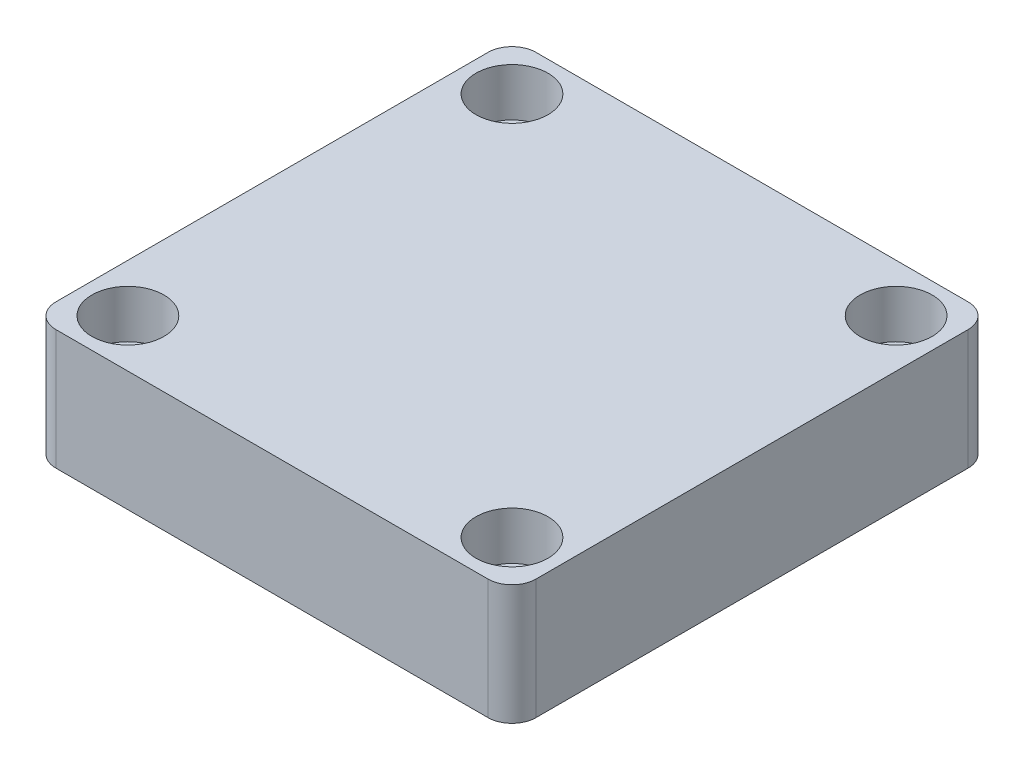
ISO-10303-21;
HEADER;
FILE_DESCRIPTION(('STEP AP214'),'2;1');
FILE_NAME('part.step','',(''),(''),'','','');
FILE_SCHEMA(('AUTOMOTIVE_DESIGN { 1 0 10303 214 1 1 1 1 }'));
ENDSEC;
DATA;
#1=APPLICATION_CONTEXT('core data for automotive mechanical design processes');
#2=APPLICATION_PROTOCOL_DEFINITION('international standard','automotive_design',2000,#1);
#3=PRODUCT_CONTEXT('',#1,'mechanical');
#4=PRODUCT('Part','Part','',(#3));
#5=PRODUCT_RELATED_PRODUCT_CATEGORY('part','',(#4));
#6=PRODUCT_DEFINITION_FORMATION('','',#4);
#7=PRODUCT_DEFINITION_CONTEXT('part definition',#1,'design');
#8=PRODUCT_DEFINITION('design','',#6,#7);
#9=PRODUCT_DEFINITION_SHAPE('','',#8);
#10=(LENGTH_UNIT() NAMED_UNIT(*) SI_UNIT(.MILLI.,.METRE.));
#11=(NAMED_UNIT(*) PLANE_ANGLE_UNIT() SI_UNIT($,.RADIAN.));
#12=(NAMED_UNIT(*) SI_UNIT($,.STERADIAN.) SOLID_ANGLE_UNIT());
#13=UNCERTAINTY_MEASURE_WITH_UNIT(LENGTH_MEASURE(1.E-05),#10,'distance_accuracy_value','');
#14=(GEOMETRIC_REPRESENTATION_CONTEXT(3) GLOBAL_UNCERTAINTY_ASSIGNED_CONTEXT((#13)) GLOBAL_UNIT_ASSIGNED_CONTEXT((#10,
#11,#12)) REPRESENTATION_CONTEXT('',''));
#15=CARTESIAN_POINT('',(0.,0.,0.));
#16=DIRECTION('',(0.,0.,1.));
#17=DIRECTION('',(1.,0.,0.));
#18=AXIS2_PLACEMENT_3D('',#15,#16,#17);
#19=CARTESIAN_POINT('',(-15.7163120567376,10.,-7.84397163120567));
#20=DIRECTION('',(0.,-1.,0.));
#21=DIRECTION('',(0.,0.,-1.));
#22=AXIS2_PLACEMENT_3D('',#19,#20,#21);
#23=CYLINDRICAL_SURFACE('',#22,1.5);
#24=CARTESIAN_POINT('',(-15.7163120567376,0.,-7.84397163120567));
#25=DIRECTION('',(0.,1.,0.));
#26=DIRECTION('',(0.,0.,1.));
#27=AXIS2_PLACEMENT_3D('',#24,#25,#26);
#28=CIRCLE('',#27,1.5);
#29=CARTESIAN_POINT('',(-15.7163120567376,0.,-6.34397163120567));
#30=VERTEX_POINT('',#29);
#31=EDGE_CURVE('E154',#30,#30,#28,.T.);
#32=ORIENTED_EDGE('',*,*,#31,.F.);
#33=EDGE_LOOP('',(#32));
#34=FACE_BOUND('',#33,.T.);
#35=CARTESIAN_POINT('',(-15.7163120567376,6.,-7.84397163120567));
#36=DIRECTION('',(0.,1.,0.));
#37=DIRECTION('',(0.,0.,1.));
#38=AXIS2_PLACEMENT_3D('',#35,#36,#37);
#39=CIRCLE('',#38,1.5);
#40=CARTESIAN_POINT('',(-15.7163120567376,6.,-6.34397163120567));
#41=VERTEX_POINT('',#40);
#42=EDGE_CURVE('E51',#41,#41,#39,.T.);
#43=ORIENTED_EDGE('',*,*,#42,.T.);
#44=EDGE_LOOP('',(#43));
#45=FACE_BOUND('',#44,.T.);
#46=ADVANCED_FACE('F47',(#34,#45),#23,.F.);
#47=CARTESIAN_POINT('',(16.2836879432624,10.,-7.84397163120567));
#48=DIRECTION('',(0.,-1.,0.));
#49=DIRECTION('',(0.,0.,-1.));
#50=AXIS2_PLACEMENT_3D('',#47,#48,#49);
#51=CYLINDRICAL_SURFACE('',#50,1.5);
#52=CARTESIAN_POINT('',(16.2836879432624,0.,-7.84397163120567));
#53=DIRECTION('',(0.,1.,0.));
#54=DIRECTION('',(0.,0.,1.));
#55=AXIS2_PLACEMENT_3D('',#52,#53,#54);
#56=CIRCLE('',#55,1.5);
#57=CARTESIAN_POINT('',(16.2836879432624,0.,-6.34397163120567));
#58=VERTEX_POINT('',#57);
#59=EDGE_CURVE('E222',#58,#58,#56,.T.);
#60=ORIENTED_EDGE('',*,*,#59,.F.);
#61=EDGE_LOOP('',(#60));
#62=FACE_BOUND('',#61,.T.);
#63=CARTESIAN_POINT('',(16.2836879432624,6.,-7.84397163120567));
#64=DIRECTION('',(0.,1.,0.));
#65=DIRECTION('',(0.,0.,1.));
#66=AXIS2_PLACEMENT_3D('',#63,#64,#65);
#67=CIRCLE('',#66,1.5);
#68=CARTESIAN_POINT('',(16.2836879432624,6.,-6.34397163120567));
#69=VERTEX_POINT('',#68);
#70=EDGE_CURVE('E204',#69,#69,#67,.T.);
#71=ORIENTED_EDGE('',*,*,#70,.T.);
#72=EDGE_LOOP('',(#71));
#73=FACE_BOUND('',#72,.T.);
#74=ADVANCED_FACE('F270',(#62,#73),#51,.F.);
#75=CARTESIAN_POINT('',(16.2836879432628,10.,24.1560283687943));
#76=DIRECTION('',(0.,-1.,0.));
#77=DIRECTION('',(0.,0.,-1.));
#78=AXIS2_PLACEMENT_3D('',#75,#76,#77);
#79=CYLINDRICAL_SURFACE('',#78,1.5);
#80=CARTESIAN_POINT('',(16.2836879432628,0.,24.1560283687943));
#81=DIRECTION('',(0.,1.,0.));
#82=DIRECTION('',(0.,0.,1.));
#83=AXIS2_PLACEMENT_3D('',#80,#81,#82);
#84=CIRCLE('',#83,1.5);
#85=CARTESIAN_POINT('',(16.2836879432628,0.,25.6560283687943));
#86=VERTEX_POINT('',#85);
#87=EDGE_CURVE('E216',#86,#86,#84,.T.);
#88=ORIENTED_EDGE('',*,*,#87,.F.);
#89=EDGE_LOOP('',(#88));
#90=FACE_BOUND('',#89,.T.);
#91=CARTESIAN_POINT('',(16.2836879432628,6.,24.1560283687943));
#92=DIRECTION('',(0.,1.,0.));
#93=DIRECTION('',(0.,0.,1.));
#94=AXIS2_PLACEMENT_3D('',#91,#92,#93);
#95=CIRCLE('',#94,1.5);
#96=CARTESIAN_POINT('',(16.2836879432628,6.,25.6560283687943));
#97=VERTEX_POINT('',#96);
#98=EDGE_CURVE('E200',#97,#97,#95,.T.);
#99=ORIENTED_EDGE('',*,*,#98,.T.);
#100=EDGE_LOOP('',(#99));
#101=FACE_BOUND('',#100,.T.);
#102=ADVANCED_FACE('F277',(#90,#101),#79,.F.);
#103=CARTESIAN_POINT('',(-15.7163120567372,10.,24.1560283687943));
#104=DIRECTION('',(0.,-1.,0.));
#105=DIRECTION('',(0.,0.,-1.));
#106=AXIS2_PLACEMENT_3D('',#103,#104,#105);
#107=CYLINDRICAL_SURFACE('',#106,1.5);
#108=CARTESIAN_POINT('',(-15.7163120567372,0.,24.1560283687943));
#109=DIRECTION('',(0.,1.,0.));
#110=DIRECTION('',(0.,0.,1.));
#111=AXIS2_PLACEMENT_3D('',#108,#109,#110);
#112=CIRCLE('',#111,1.5);
#113=CARTESIAN_POINT('',(-15.7163120567372,0.,25.6560283687943));
#114=VERTEX_POINT('',#113);
#115=EDGE_CURVE('E211',#114,#114,#112,.T.);
#116=ORIENTED_EDGE('',*,*,#115,.F.);
#117=EDGE_LOOP('',(#116));
#118=FACE_BOUND('',#117,.T.);
#119=CARTESIAN_POINT('',(-15.7163120567372,6.,24.1560283687943));
#120=DIRECTION('',(0.,1.,0.));
#121=DIRECTION('',(0.,0.,1.));
#122=AXIS2_PLACEMENT_3D('',#119,#120,#121);
#123=CIRCLE('',#122,1.5);
#124=CARTESIAN_POINT('',(-15.7163120567372,6.,25.6560283687943));
#125=VERTEX_POINT('',#124);
#126=EDGE_CURVE('E196',#125,#125,#123,.T.);
#127=ORIENTED_EDGE('',*,*,#126,.T.);
#128=EDGE_LOOP('',(#127));
#129=FACE_BOUND('',#128,.T.);
#130=ADVANCED_FACE('F285',(#118,#129),#107,.F.);
#131=CARTESIAN_POINT('',(0.,10.,0.));
#132=DIRECTION('',(0.,1.,0.));
#133=DIRECTION('',(0.,0.,1.));
#134=AXIS2_PLACEMENT_3D('',#131,#132,#133);
#135=PLANE('',#134);
#136=CARTESIAN_POINT('',(-15.7163120567372,10.,24.1560283687943));
#137=DIRECTION('',(0.,1.,0.));
#138=DIRECTION('',(0.,0.,1.));
#139=AXIS2_PLACEMENT_3D('',#136,#137,#138);
#140=CIRCLE('',#139,3.);
#141=CARTESIAN_POINT('',(-15.7163120567372,10.,27.1560283687943));
#142=VERTEX_POINT('',#141);
#143=EDGE_CURVE('E456',#142,#142,#140,.T.);
#144=ORIENTED_EDGE('',*,*,#143,.F.);
#145=EDGE_LOOP('',(#144));
#146=FACE_BOUND('',#145,.T.);
#147=CARTESIAN_POINT('',(16.2836879432628,10.,24.1560283687943));
#148=DIRECTION('',(0.,1.,0.));
#149=DIRECTION('',(0.,0.,1.));
#150=AXIS2_PLACEMENT_3D('',#147,#148,#149);
#151=CIRCLE('',#150,3.);
#152=CARTESIAN_POINT('',(16.2836879432628,10.,27.1560283687943));
#153=VERTEX_POINT('',#152);
#154=EDGE_CURVE('E464',#153,#153,#151,.T.);
#155=ORIENTED_EDGE('',*,*,#154,.F.);
#156=EDGE_LOOP('',(#155));
#157=FACE_BOUND('',#156,.T.);
#158=CARTESIAN_POINT('',(16.2836879432624,10.,-7.84397163120567));
#159=DIRECTION('',(0.,1.,0.));
#160=DIRECTION('',(0.,0.,1.));
#161=AXIS2_PLACEMENT_3D('',#158,#159,#160);
#162=CIRCLE('',#161,3.);
#163=CARTESIAN_POINT('',(16.2836879432624,10.,-4.84397163120567));
#164=VERTEX_POINT('',#163);
#165=EDGE_CURVE('E450',#164,#164,#162,.T.);
#166=ORIENTED_EDGE('',*,*,#165,.F.);
#167=EDGE_LOOP('',(#166));
#168=FACE_BOUND('',#167,.T.);
#169=CARTESIAN_POINT('',(-15.7163120567376,10.,-7.84397163120567));
#170=DIRECTION('',(0.,1.,0.));
#171=DIRECTION('',(0.,0.,1.));
#172=AXIS2_PLACEMENT_3D('',#169,#170,#171);
#173=CIRCLE('',#172,3.);
#174=CARTESIAN_POINT('',(-15.7163120567376,10.,-4.84397163120567));
#175=VERTEX_POINT('',#174);
#176=EDGE_CURVE('E225',#175,#175,#173,.T.);
#177=ORIENTED_EDGE('',*,*,#176,.F.);
#178=EDGE_LOOP('',(#177));
#179=FACE_BOUND('',#178,.T.);
#180=DIRECTION('',(0.,0.,1.));
#181=VECTOR('',#180,1.);
#182=CARTESIAN_POINT('',(-19.7163120567376,10.,-11.8439716312057));
#183=LINE('',#182,#181);
#184=CARTESIAN_POINT('',(-19.7163120567376,10.,-9.84397163120567));
#185=VERTEX_POINT('',#184);
#186=CARTESIAN_POINT('',(-19.7163120567376,10.,26.1560283687943));
#187=VERTEX_POINT('',#186);
#188=EDGE_CURVE('E160',#185,#187,#183,.T.);
#189=ORIENTED_EDGE('',*,*,#188,.T.);
#190=CARTESIAN_POINT('',(-17.7163120567376,10.,26.1560283687943));
#191=DIRECTION('',(0.,1.,0.));
#192=DIRECTION('',(0.,0.,1.));
#193=AXIS2_PLACEMENT_3D('',#190,#191,#192);
#194=CIRCLE('',#193,2.);
#195=CARTESIAN_POINT('',(-17.7163120567376,10.,28.1560283687943));
#196=VERTEX_POINT('',#195);
#197=EDGE_CURVE('E184',#187,#196,#194,.T.);
#198=ORIENTED_EDGE('',*,*,#197,.T.);
#199=DIRECTION('',(1.,0.,0.));
#200=VECTOR('',#199,1.);
#201=CARTESIAN_POINT('',(-19.7163120567376,10.,28.1560283687943));
#202=LINE('',#201,#200);
#203=CARTESIAN_POINT('',(18.2836879432624,10.,28.1560283687943));
#204=VERTEX_POINT('',#203);
#205=EDGE_CURVE('E137',#196,#204,#202,.T.);
#206=ORIENTED_EDGE('',*,*,#205,.T.);
#207=CARTESIAN_POINT('',(18.2836879432624,10.,26.1560283687943));
#208=DIRECTION('',(0.,1.,0.));
#209=DIRECTION('',(0.,0.,1.));
#210=AXIS2_PLACEMENT_3D('',#207,#208,#209);
#211=CIRCLE('',#210,2.);
#212=CARTESIAN_POINT('',(20.2836879432624,10.,26.1560283687943));
#213=VERTEX_POINT('',#212);
#214=EDGE_CURVE('E181',#204,#213,#211,.T.);
#215=ORIENTED_EDGE('',*,*,#214,.T.);
#216=DIRECTION('',(0.,0.,-1.));
#217=VECTOR('',#216,1.);
#218=CARTESIAN_POINT('',(20.2836879432624,10.,-11.8439716312057));
#219=LINE('',#218,#217);
#220=CARTESIAN_POINT('',(20.2836879432624,10.,-9.84397163120567));
#221=VERTEX_POINT('',#220);
#222=EDGE_CURVE('E239',#213,#221,#219,.T.);
#223=ORIENTED_EDGE('',*,*,#222,.T.);
#224=CARTESIAN_POINT('',(18.2836879432624,10.,-9.84397163120567));
#225=DIRECTION('',(0.,1.,0.));
#226=DIRECTION('',(0.,0.,1.));
#227=AXIS2_PLACEMENT_3D('',#224,#225,#226);
#228=CIRCLE('',#227,2.);
#229=CARTESIAN_POINT('',(18.2836879432624,10.,-11.8439716312057));
#230=VERTEX_POINT('',#229);
#231=EDGE_CURVE('E71',#221,#230,#228,.T.);
#232=ORIENTED_EDGE('',*,*,#231,.T.);
#233=DIRECTION('',(-1.,0.,0.));
#234=VECTOR('',#233,1.);
#235=CARTESIAN_POINT('',(-19.7163120567376,10.,-11.8439716312057));
#236=LINE('',#235,#234);
#237=CARTESIAN_POINT('',(-17.7163120567376,10.,-11.8439716312057));
#238=VERTEX_POINT('',#237);
#239=EDGE_CURVE('E162',#230,#238,#236,.T.);
#240=ORIENTED_EDGE('',*,*,#239,.T.);
#241=CARTESIAN_POINT('',(-17.7163120567376,10.,-9.84397163120567));
#242=DIRECTION('',(0.,1.,0.));
#243=DIRECTION('',(0.,0.,1.));
#244=AXIS2_PLACEMENT_3D('',#241,#242,#243);
#245=CIRCLE('',#244,2.);
#246=EDGE_CURVE('E176',#238,#185,#245,.T.);
#247=ORIENTED_EDGE('',*,*,#246,.T.);
#248=EDGE_LOOP('',(#189,#198,#206,#215,#223,#232,#240,#247));
#249=FACE_BOUND('',#248,.T.);
#250=ADVANCED_FACE('F243',(#146,#157,#168,#179,#249),#135,.T.);
#251=CARTESIAN_POINT('',(0.,0.,0.));
#252=DIRECTION('',(0.,1.,0.));
#253=DIRECTION('',(0.,0.,1.));
#254=AXIS2_PLACEMENT_3D('',#251,#252,#253);
#255=PLANE('',#254);
#256=DIRECTION('',(1.,0.,0.));
#257=VECTOR('',#256,1.);
#258=CARTESIAN_POINT('',(-19.7163120567376,0.,28.1560283687943));
#259=LINE('',#258,#257);
#260=CARTESIAN_POINT('',(-17.7163120567376,0.,28.1560283687943));
#261=VERTEX_POINT('',#260);
#262=CARTESIAN_POINT('',(18.2836879432624,0.,28.1560283687943));
#263=VERTEX_POINT('',#262);
#264=EDGE_CURVE('E134',#261,#263,#259,.T.);
#265=ORIENTED_EDGE('',*,*,#264,.F.);
#266=CARTESIAN_POINT('',(-17.7163120567376,0.,26.1560283687943));
#267=DIRECTION('',(0.,1.,0.));
#268=DIRECTION('',(0.,0.,1.));
#269=AXIS2_PLACEMENT_3D('',#266,#267,#268);
#270=CIRCLE('',#269,2.);
#271=CARTESIAN_POINT('',(-19.7163120567376,0.,26.1560283687943));
#272=VERTEX_POINT('',#271);
#273=EDGE_CURVE('E116',#261,#272,#270,.F.);
#274=ORIENTED_EDGE('',*,*,#273,.T.);
#275=DIRECTION('',(0.,0.,1.));
#276=VECTOR('',#275,1.);
#277=CARTESIAN_POINT('',(-19.7163120567376,0.,-11.8439716312057));
#278=LINE('',#277,#276);
#279=CARTESIAN_POINT('',(-19.7163120567376,0.,-9.84397163120567));
#280=VERTEX_POINT('',#279);
#281=EDGE_CURVE('E147',#280,#272,#278,.T.);
#282=ORIENTED_EDGE('',*,*,#281,.F.);
#283=CARTESIAN_POINT('',(-17.7163120567376,0.,-9.84397163120567));
#284=DIRECTION('',(0.,1.,0.));
#285=DIRECTION('',(0.,0.,1.));
#286=AXIS2_PLACEMENT_3D('',#283,#284,#285);
#287=CIRCLE('',#286,2.);
#288=CARTESIAN_POINT('',(-17.7163120567376,0.,-11.8439716312057));
#289=VERTEX_POINT('',#288);
#290=EDGE_CURVE('E139',#280,#289,#287,.F.);
#291=ORIENTED_EDGE('',*,*,#290,.T.);
#292=DIRECTION('',(-1.,0.,0.));
#293=VECTOR('',#292,1.);
#294=CARTESIAN_POINT('',(-19.7163120567376,0.,-11.8439716312057));
#295=LINE('',#294,#293);
#296=CARTESIAN_POINT('',(18.2836879432624,0.,-11.8439716312057));
#297=VERTEX_POINT('',#296);
#298=EDGE_CURVE('E152',#297,#289,#295,.T.);
#299=ORIENTED_EDGE('',*,*,#298,.F.);
#300=CARTESIAN_POINT('',(18.2836879432624,0.,-9.84397163120567));
#301=DIRECTION('',(0.,1.,0.));
#302=DIRECTION('',(0.,0.,1.));
#303=AXIS2_PLACEMENT_3D('',#300,#301,#302);
#304=CIRCLE('',#303,2.);
#305=CARTESIAN_POINT('',(20.2836879432624,0.,-9.84397163120567));
#306=VERTEX_POINT('',#305);
#307=EDGE_CURVE('E166',#297,#306,#304,.F.);
#308=ORIENTED_EDGE('',*,*,#307,.T.);
#309=DIRECTION('',(0.,0.,-1.));
#310=VECTOR('',#309,1.);
#311=CARTESIAN_POINT('',(20.2836879432624,0.,-11.8439716312057));
#312=LINE('',#311,#310);
#313=CARTESIAN_POINT('',(20.2836879432624,0.,26.1560283687943));
#314=VERTEX_POINT('',#313);
#315=EDGE_CURVE('E146',#314,#306,#312,.T.);
#316=ORIENTED_EDGE('',*,*,#315,.F.);
#317=CARTESIAN_POINT('',(18.2836879432624,0.,26.1560283687943));
#318=DIRECTION('',(0.,1.,0.));
#319=DIRECTION('',(0.,0.,1.));
#320=AXIS2_PLACEMENT_3D('',#317,#318,#319);
#321=CIRCLE('',#320,2.);
#322=EDGE_CURVE('E128',#314,#263,#321,.F.);
#323=ORIENTED_EDGE('',*,*,#322,.T.);
#324=EDGE_LOOP('',(#265,#274,#282,#291,#299,#308,#316,#323));
#325=FACE_BOUND('',#324,.T.);
#326=ORIENTED_EDGE('',*,*,#31,.T.);
#327=EDGE_LOOP('',(#326));
#328=FACE_BOUND('',#327,.T.);
#329=ORIENTED_EDGE('',*,*,#59,.T.);
#330=EDGE_LOOP('',(#329));
#331=FACE_BOUND('',#330,.T.);
#332=ORIENTED_EDGE('',*,*,#87,.T.);
#333=EDGE_LOOP('',(#332));
#334=FACE_BOUND('',#333,.T.);
#335=ORIENTED_EDGE('',*,*,#115,.T.);
#336=EDGE_LOOP('',(#335));
#337=FACE_BOUND('',#336,.T.);
#338=ADVANCED_FACE('F142',(#325,#328,#331,#334,#337),#255,.F.);
#339=CARTESIAN_POINT('',(-19.7163120567376,10.,-11.8439716312057));
#340=DIRECTION('',(1.,0.,0.));
#341=DIRECTION('',(0.,0.,-1.));
#342=AXIS2_PLACEMENT_3D('',#339,#340,#341);
#343=PLANE('',#342);
#344=ORIENTED_EDGE('',*,*,#281,.T.);
#345=DIRECTION('',(0.,-1.,0.));
#346=VECTOR('',#345,1.);
#347=CARTESIAN_POINT('',(-19.7163120567376,10.,26.1560283687943));
#348=LINE('',#347,#346);
#349=EDGE_CURVE('E121',#272,#187,#348,.F.);
#350=ORIENTED_EDGE('',*,*,#349,.T.);
#351=ORIENTED_EDGE('',*,*,#188,.F.);
#352=DIRECTION('',(0.,-1.,0.));
#353=VECTOR('',#352,1.);
#354=CARTESIAN_POINT('',(-19.7163120567376,10.,-9.84397163120567));
#355=LINE('',#354,#353);
#356=EDGE_CURVE('E127',#185,#280,#355,.T.);
#357=ORIENTED_EDGE('',*,*,#356,.T.);
#358=EDGE_LOOP('',(#344,#350,#351,#357));
#359=FACE_BOUND('',#358,.T.);
#360=ADVANCED_FACE('F249',(#359),#343,.F.);
#361=CARTESIAN_POINT('',(-19.7163120567376,10.,28.1560283687943));
#362=DIRECTION('',(0.,0.,-1.));
#363=DIRECTION('',(-1.,0.,0.));
#364=AXIS2_PLACEMENT_3D('',#361,#362,#363);
#365=PLANE('',#364);
#366=ORIENTED_EDGE('',*,*,#205,.F.);
#367=DIRECTION('',(0.,-1.,0.));
#368=VECTOR('',#367,1.);
#369=CARTESIAN_POINT('',(-17.7163120567376,10.,28.1560283687943));
#370=LINE('',#369,#368);
#371=EDGE_CURVE('E120',#196,#261,#370,.T.);
#372=ORIENTED_EDGE('',*,*,#371,.T.);
#373=ORIENTED_EDGE('',*,*,#264,.T.);
#374=DIRECTION('',(0.,-1.,0.));
#375=VECTOR('',#374,1.);
#376=CARTESIAN_POINT('',(18.2836879432624,10.,28.1560283687943));
#377=LINE('',#376,#375);
#378=EDGE_CURVE('E140',#263,#204,#377,.F.);
#379=ORIENTED_EDGE('',*,*,#378,.T.);
#380=EDGE_LOOP('',(#366,#372,#373,#379));
#381=FACE_BOUND('',#380,.T.);
#382=ADVANCED_FACE('F133',(#381),#365,.F.);
#383=CARTESIAN_POINT('',(20.2836879432624,10.,-11.8439716312057));
#384=DIRECTION('',(-1.,0.,0.));
#385=DIRECTION('',(0.,0.,1.));
#386=AXIS2_PLACEMENT_3D('',#383,#384,#385);
#387=PLANE('',#386);
#388=ORIENTED_EDGE('',*,*,#222,.F.);
#389=DIRECTION('',(0.,-1.,0.));
#390=VECTOR('',#389,1.);
#391=CARTESIAN_POINT('',(20.2836879432624,10.,26.1560283687943));
#392=LINE('',#391,#390);
#393=EDGE_CURVE('E190',#213,#314,#392,.T.);
#394=ORIENTED_EDGE('',*,*,#393,.T.);
#395=ORIENTED_EDGE('',*,*,#315,.T.);
#396=DIRECTION('',(0.,-1.,0.));
#397=VECTOR('',#396,1.);
#398=CARTESIAN_POINT('',(20.2836879432624,10.,-9.84397163120567));
#399=LINE('',#398,#397);
#400=EDGE_CURVE('E187',#306,#221,#399,.F.);
#401=ORIENTED_EDGE('',*,*,#400,.T.);
#402=EDGE_LOOP('',(#388,#394,#395,#401));
#403=FACE_BOUND('',#402,.T.);
#404=ADVANCED_FACE('F257',(#403),#387,.F.);
#405=CARTESIAN_POINT('',(-19.7163120567376,10.,-11.8439716312057));
#406=DIRECTION('',(0.,0.,1.));
#407=DIRECTION('',(1.,0.,0.));
#408=AXIS2_PLACEMENT_3D('',#405,#406,#407);
#409=PLANE('',#408);
#410=ORIENTED_EDGE('',*,*,#239,.F.);
#411=DIRECTION('',(0.,-1.,0.));
#412=VECTOR('',#411,1.);
#413=CARTESIAN_POINT('',(18.2836879432624,10.,-11.8439716312057));
#414=LINE('',#413,#412);
#415=EDGE_CURVE('E11',#230,#297,#414,.T.);
#416=ORIENTED_EDGE('',*,*,#415,.T.);
#417=ORIENTED_EDGE('',*,*,#298,.T.);
#418=DIRECTION('',(0.,-1.,0.));
#419=VECTOR('',#418,1.);
#420=CARTESIAN_POINT('',(-17.7163120567376,10.,-11.8439716312057));
#421=LINE('',#420,#419);
#422=EDGE_CURVE('E57',#289,#238,#421,.F.);
#423=ORIENTED_EDGE('',*,*,#422,.T.);
#424=EDGE_LOOP('',(#410,#416,#417,#423));
#425=FACE_BOUND('',#424,.T.);
#426=ADVANCED_FACE('F251',(#425),#409,.F.);
#427=CARTESIAN_POINT('',(-17.7163120567376,10.,26.1560283687943));
#428=DIRECTION('',(0.,-1.,0.));
#429=DIRECTION('',(0.,0.,-1.));
#430=AXIS2_PLACEMENT_3D('',#427,#428,#429);
#431=CYLINDRICAL_SURFACE('',#430,2.);
#432=ORIENTED_EDGE('',*,*,#197,.F.);
#433=ORIENTED_EDGE('',*,*,#349,.F.);
#434=ORIENTED_EDGE('',*,*,#273,.F.);
#435=ORIENTED_EDGE('',*,*,#371,.F.);
#436=EDGE_LOOP('',(#432,#433,#434,#435));
#437=FACE_BOUND('',#436,.T.);
#438=ADVANCED_FACE('F119',(#437),#431,.T.);
#439=CARTESIAN_POINT('',(18.2836879432624,10.,26.1560283687943));
#440=DIRECTION('',(0.,-1.,0.));
#441=DIRECTION('',(0.,0.,-1.));
#442=AXIS2_PLACEMENT_3D('',#439,#440,#441);
#443=CYLINDRICAL_SURFACE('',#442,2.);
#444=ORIENTED_EDGE('',*,*,#214,.F.);
#445=ORIENTED_EDGE('',*,*,#378,.F.);
#446=ORIENTED_EDGE('',*,*,#322,.F.);
#447=ORIENTED_EDGE('',*,*,#393,.F.);
#448=EDGE_LOOP('',(#444,#445,#446,#447));
#449=FACE_BOUND('',#448,.T.);
#450=ADVANCED_FACE('F261',(#449),#443,.T.);
#451=CARTESIAN_POINT('',(18.2836879432624,10.,-9.84397163120567));
#452=DIRECTION('',(0.,-1.,0.));
#453=DIRECTION('',(0.,0.,-1.));
#454=AXIS2_PLACEMENT_3D('',#451,#452,#453);
#455=CYLINDRICAL_SURFACE('',#454,2.);
#456=ORIENTED_EDGE('',*,*,#231,.F.);
#457=ORIENTED_EDGE('',*,*,#400,.F.);
#458=ORIENTED_EDGE('',*,*,#307,.F.);
#459=ORIENTED_EDGE('',*,*,#415,.F.);
#460=EDGE_LOOP('',(#456,#457,#458,#459));
#461=FACE_BOUND('',#460,.T.);
#462=ADVANCED_FACE('F253',(#461),#455,.T.);
#463=CARTESIAN_POINT('',(-17.7163120567376,10.,-9.84397163120567));
#464=DIRECTION('',(0.,-1.,0.));
#465=DIRECTION('',(0.,0.,-1.));
#466=AXIS2_PLACEMENT_3D('',#463,#464,#465);
#467=CYLINDRICAL_SURFACE('',#466,2.);
#468=ORIENTED_EDGE('',*,*,#246,.F.);
#469=ORIENTED_EDGE('',*,*,#422,.F.);
#470=ORIENTED_EDGE('',*,*,#290,.F.);
#471=ORIENTED_EDGE('',*,*,#356,.F.);
#472=EDGE_LOOP('',(#468,#469,#470,#471));
#473=FACE_BOUND('',#472,.T.);
#474=ADVANCED_FACE('F49',(#473),#467,.T.);
#475=CARTESIAN_POINT('',(-15.7163120567372,6.,24.1560283687943));
#476=DIRECTION('',(0.,1.,0.));
#477=DIRECTION('',(0.,0.,1.));
#478=AXIS2_PLACEMENT_3D('',#475,#476,#477);
#479=CYLINDRICAL_SURFACE('',#478,3.);
#480=CARTESIAN_POINT('',(-15.7163120567372,6.,24.1560283687943));
#481=DIRECTION('',(0.,1.,0.));
#482=DIRECTION('',(0.,0.,1.));
#483=AXIS2_PLACEMENT_3D('',#480,#481,#482);
#484=CIRCLE('',#483,3.);
#485=CARTESIAN_POINT('',(-15.7163120567372,6.,27.1560283687943));
#486=VERTEX_POINT('',#485);
#487=EDGE_CURVE('E452',#486,#486,#484,.T.);
#488=ORIENTED_EDGE('',*,*,#487,.F.);
#489=EDGE_LOOP('',(#488));
#490=FACE_BOUND('',#489,.T.);
#491=ORIENTED_EDGE('',*,*,#143,.T.);
#492=EDGE_LOOP('',(#491));
#493=FACE_BOUND('',#492,.T.);
#494=ADVANCED_FACE('F339',(#490,#493),#479,.F.);
#495=CARTESIAN_POINT('',(-15.7163120567372,6.,24.1560283687943));
#496=DIRECTION('',(0.,1.,0.));
#497=DIRECTION('',(0.,0.,1.));
#498=AXIS2_PLACEMENT_3D('',#495,#496,#497);
#499=PLANE('',#498);
#500=ORIENTED_EDGE('',*,*,#126,.F.);
#501=EDGE_LOOP('',(#500));
#502=FACE_BOUND('',#501,.T.);
#503=ORIENTED_EDGE('',*,*,#487,.T.);
#504=EDGE_LOOP('',(#503));
#505=FACE_BOUND('',#504,.T.);
#506=ADVANCED_FACE('F371',(#502,#505),#499,.T.);
#507=CARTESIAN_POINT('',(16.2836879432628,6.,24.1560283687943));
#508=DIRECTION('',(0.,1.,0.));
#509=DIRECTION('',(0.,0.,1.));
#510=AXIS2_PLACEMENT_3D('',#507,#508,#509);
#511=CYLINDRICAL_SURFACE('',#510,3.);
#512=CARTESIAN_POINT('',(16.2836879432628,6.,24.1560283687943));
#513=DIRECTION('',(0.,1.,0.));
#514=DIRECTION('',(0.,0.,1.));
#515=AXIS2_PLACEMENT_3D('',#512,#513,#514);
#516=CIRCLE('',#515,3.);
#517=CARTESIAN_POINT('',(16.2836879432628,6.,27.1560283687943));
#518=VERTEX_POINT('',#517);
#519=EDGE_CURVE('E460',#518,#518,#516,.T.);
#520=ORIENTED_EDGE('',*,*,#519,.F.);
#521=EDGE_LOOP('',(#520));
#522=FACE_BOUND('',#521,.T.);
#523=ORIENTED_EDGE('',*,*,#154,.T.);
#524=EDGE_LOOP('',(#523));
#525=FACE_BOUND('',#524,.T.);
#526=ADVANCED_FACE('F381',(#522,#525),#511,.F.);
#527=CARTESIAN_POINT('',(16.2836879432628,6.,24.1560283687943));
#528=DIRECTION('',(0.,1.,0.));
#529=DIRECTION('',(0.,0.,1.));
#530=AXIS2_PLACEMENT_3D('',#527,#528,#529);
#531=PLANE('',#530);
#532=ORIENTED_EDGE('',*,*,#98,.F.);
#533=EDGE_LOOP('',(#532));
#534=FACE_BOUND('',#533,.T.);
#535=ORIENTED_EDGE('',*,*,#519,.T.);
#536=EDGE_LOOP('',(#535));
#537=FACE_BOUND('',#536,.T.);
#538=ADVANCED_FACE('F391',(#534,#537),#531,.T.);
#539=CARTESIAN_POINT('',(16.2836879432624,6.,-7.84397163120567));
#540=DIRECTION('',(0.,1.,0.));
#541=DIRECTION('',(0.,0.,1.));
#542=AXIS2_PLACEMENT_3D('',#539,#540,#541);
#543=CYLINDRICAL_SURFACE('',#542,3.);
#544=CARTESIAN_POINT('',(16.2836879432624,6.,-7.84397163120567));
#545=DIRECTION('',(0.,1.,0.));
#546=DIRECTION('',(0.,0.,1.));
#547=AXIS2_PLACEMENT_3D('',#544,#545,#546);
#548=CIRCLE('',#547,3.);
#549=CARTESIAN_POINT('',(16.2836879432624,6.,-4.84397163120567));
#550=VERTEX_POINT('',#549);
#551=EDGE_CURVE('E468',#550,#550,#548,.T.);
#552=ORIENTED_EDGE('',*,*,#551,.F.);
#553=EDGE_LOOP('',(#552));
#554=FACE_BOUND('',#553,.T.);
#555=ORIENTED_EDGE('',*,*,#165,.T.);
#556=EDGE_LOOP('',(#555));
#557=FACE_BOUND('',#556,.T.);
#558=ADVANCED_FACE('F401',(#554,#557),#543,.F.);
#559=CARTESIAN_POINT('',(16.2836879432624,6.,-7.84397163120567));
#560=DIRECTION('',(0.,1.,0.));
#561=DIRECTION('',(0.,0.,1.));
#562=AXIS2_PLACEMENT_3D('',#559,#560,#561);
#563=PLANE('',#562);
#564=ORIENTED_EDGE('',*,*,#70,.F.);
#565=EDGE_LOOP('',(#564));
#566=FACE_BOUND('',#565,.T.);
#567=ORIENTED_EDGE('',*,*,#551,.T.);
#568=EDGE_LOOP('',(#567));
#569=FACE_BOUND('',#568,.T.);
#570=ADVANCED_FACE('F411',(#566,#569),#563,.T.);
#571=CARTESIAN_POINT('',(-15.7163120567376,6.,-7.84397163120567));
#572=DIRECTION('',(0.,1.,0.));
#573=DIRECTION('',(0.,0.,1.));
#574=AXIS2_PLACEMENT_3D('',#571,#572,#573);
#575=CYLINDRICAL_SURFACE('',#574,3.);
#576=CARTESIAN_POINT('',(-15.7163120567376,6.,-7.84397163120567));
#577=DIRECTION('',(0.,1.,0.));
#578=DIRECTION('',(0.,0.,1.));
#579=AXIS2_PLACEMENT_3D('',#576,#577,#578);
#580=CIRCLE('',#579,3.);
#581=CARTESIAN_POINT('',(-15.7163120567376,6.,-4.84397163120567));
#582=VERTEX_POINT('',#581);
#583=EDGE_CURVE('E201',#582,#582,#580,.T.);
#584=ORIENTED_EDGE('',*,*,#583,.F.);
#585=EDGE_LOOP('',(#584));
#586=FACE_BOUND('',#585,.T.);
#587=ORIENTED_EDGE('',*,*,#176,.T.);
#588=EDGE_LOOP('',(#587));
#589=FACE_BOUND('',#588,.T.);
#590=ADVANCED_FACE('F421',(#586,#589),#575,.F.);
#591=CARTESIAN_POINT('',(-15.7163120567376,6.,-7.84397163120567));
#592=DIRECTION('',(0.,1.,0.));
#593=DIRECTION('',(0.,0.,1.));
#594=AXIS2_PLACEMENT_3D('',#591,#592,#593);
#595=PLANE('',#594);
#596=ORIENTED_EDGE('',*,*,#42,.F.);
#597=EDGE_LOOP('',(#596));
#598=FACE_BOUND('',#597,.T.);
#599=ORIENTED_EDGE('',*,*,#583,.T.);
#600=EDGE_LOOP('',(#599));
#601=FACE_BOUND('',#600,.T.);
#602=ADVANCED_FACE('F431',(#598,#601),#595,.T.);
#603=CLOSED_SHELL('',(#46,#74,#102,#130,#250,#338,#360,#382,#404,#426,#438,#450,#462,#474,#494,
#506,#526,#538,#558,#570,#590,#602));
#604=MANIFOLD_SOLID_BREP('B2',#603);
#605=ADVANCED_BREP_SHAPE_REPRESENTATION('',(#18,#604),#14);
#606=SHAPE_DEFINITION_REPRESENTATION(#9,#605);
ENDSEC;
END-ISO-10303-21;
